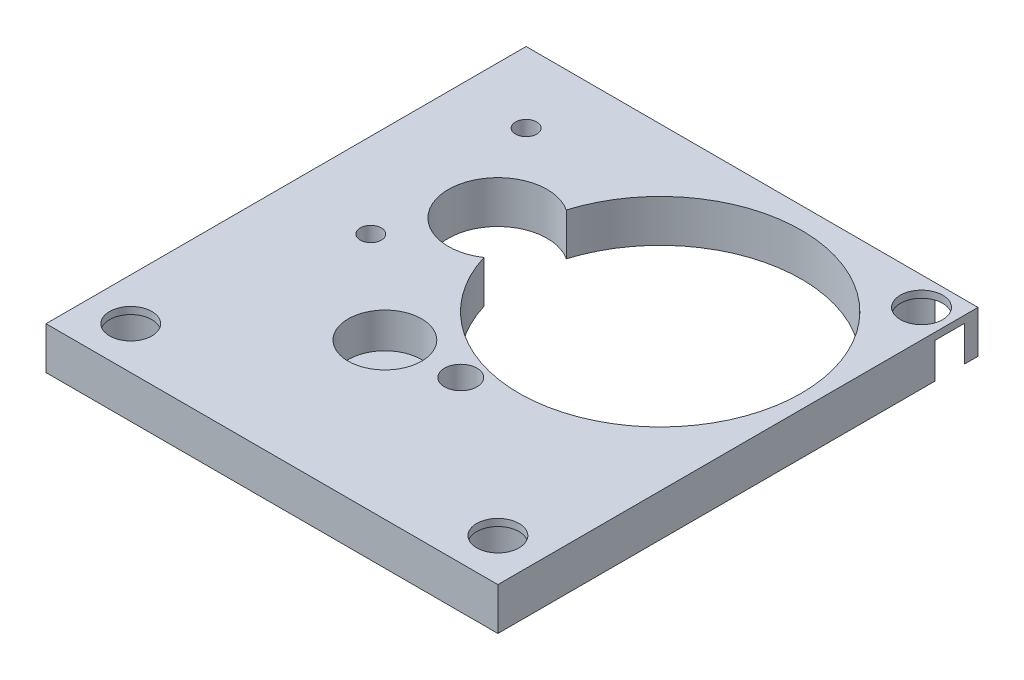
ISO-10303-21;
HEADER;
FILE_DESCRIPTION(('STEP AP214'),'2;1');
FILE_NAME('part.step','',(''),(''),'','','');
FILE_SCHEMA(('AUTOMOTIVE_DESIGN { 1 0 10303 214 1 1 1 1 }'));
ENDSEC;
DATA;
#1=APPLICATION_CONTEXT('core data for automotive mechanical design processes');
#2=APPLICATION_PROTOCOL_DEFINITION('international standard','automotive_design',2000,#1);
#3=PRODUCT_CONTEXT('',#1,'mechanical');
#4=PRODUCT('Part','Part','',(#3));
#5=PRODUCT_RELATED_PRODUCT_CATEGORY('part','',(#4));
#6=PRODUCT_DEFINITION_FORMATION('','',#4);
#7=PRODUCT_DEFINITION_CONTEXT('part definition',#1,'design');
#8=PRODUCT_DEFINITION('design','',#6,#7);
#9=PRODUCT_DEFINITION_SHAPE('','',#8);
#10=(LENGTH_UNIT() NAMED_UNIT(*) SI_UNIT(.MILLI.,.METRE.));
#11=(NAMED_UNIT(*) PLANE_ANGLE_UNIT() SI_UNIT($,.RADIAN.));
#12=(NAMED_UNIT(*) SI_UNIT($,.STERADIAN.) SOLID_ANGLE_UNIT());
#13=UNCERTAINTY_MEASURE_WITH_UNIT(LENGTH_MEASURE(1.E-05),#10,'distance_accuracy_value','');
#14=(GEOMETRIC_REPRESENTATION_CONTEXT(3) GLOBAL_UNCERTAINTY_ASSIGNED_CONTEXT((#13)) GLOBAL_UNIT_ASSIGNED_CONTEXT((#10,
#11,#12)) REPRESENTATION_CONTEXT('',''));
#15=CARTESIAN_POINT('',(0.,0.,0.));
#16=DIRECTION('',(0.,0.,1.));
#17=DIRECTION('',(1.,0.,0.));
#18=AXIS2_PLACEMENT_3D('',#15,#16,#17);
#19=CARTESIAN_POINT('',(0.,-0.5,0.));
#20=DIRECTION('',(0.,-1.,0.));
#21=DIRECTION('',(0.,0.,-1.));
#22=AXIS2_PLACEMENT_3D('',#19,#20,#21);
#23=PLANE('',#22);
#24=CARTESIAN_POINT('',(16.9999999999998,-0.5,-20.9999999999998));
#25=DIRECTION('',(0.,-1.,0.));
#26=DIRECTION('',(0.,0.,-1.));
#27=AXIS2_PLACEMENT_3D('',#24,#25,#26);
#28=CIRCLE('',#27,2.25);
#29=CARTESIAN_POINT('',(18.0307764064039,-0.5,-23.));
#30=VERTEX_POINT('',#29);
#31=CARTESIAN_POINT('',(19.,-0.5,-22.0307764064039));
#32=VERTEX_POINT('',#31);
#33=EDGE_CURVE('E210',#30,#32,#28,.T.);
#34=ORIENTED_EDGE('',*,*,#33,.F.);
#35=DIRECTION('',(1.,0.,0.));
#36=VECTOR('',#35,1.);
#37=CARTESIAN_POINT('',(-13.,-0.5,-23.));
#38=LINE('',#37,#36);
#39=CARTESIAN_POINT('',(19.,-0.5,-23.));
#40=VERTEX_POINT('',#39);
#41=EDGE_CURVE('E222',#30,#40,#38,.T.);
#42=ORIENTED_EDGE('',*,*,#41,.T.);
#43=DIRECTION('',(0.,0.,1.));
#44=VECTOR('',#43,1.);
#45=CARTESIAN_POINT('',(19.,-0.5,-23.));
#46=LINE('',#45,#44);
#47=EDGE_CURVE('E225',#40,#32,#46,.T.);
#48=ORIENTED_EDGE('',*,*,#47,.T.);
#49=EDGE_LOOP('',(#34,#42,#48));
#50=FACE_BOUND('',#49,.T.);
#51=ADVANCED_FACE('F128',(#50),#23,.T.);
#52=CARTESIAN_POINT('',(-9.99999999999997,2.5,8.00000000000007));
#53=DIRECTION('',(0.,-1.,0.));
#54=DIRECTION('',(0.,0.,-1.));
#55=AXIS2_PLACEMENT_3D('',#52,#53,#54);
#56=CYLINDRICAL_SURFACE('',#55,1.5);
#57=CARTESIAN_POINT('',(-9.99999999999997,2.5,8.00000000000007));
#58=DIRECTION('',(0.,-1.,0.));
#59=DIRECTION('',(0.,0.,-1.));
#60=AXIS2_PLACEMENT_3D('',#57,#58,#59);
#61=CIRCLE('',#60,1.5);
#62=CARTESIAN_POINT('',(-9.99999999999997,2.5,6.50000000000007));
#63=VERTEX_POINT('',#62);
#64=EDGE_CURVE('E217',#63,#63,#61,.T.);
#65=ORIENTED_EDGE('',*,*,#64,.F.);
#66=EDGE_LOOP('',(#65));
#67=FACE_BOUND('',#66,.T.);
#68=CARTESIAN_POINT('',(-9.99999999999997,2.,8.00000000000007));
#69=DIRECTION('',(0.,-1.,0.));
#70=DIRECTION('',(0.,0.,-1.));
#71=AXIS2_PLACEMENT_3D('',#68,#69,#70);
#72=CIRCLE('',#71,1.5);
#73=CARTESIAN_POINT('',(-9.99999999999997,2.,6.50000000000007));
#74=VERTEX_POINT('',#73);
#75=EDGE_CURVE('E132',#74,#74,#72,.F.);
#76=ORIENTED_EDGE('',*,*,#75,.F.);
#77=EDGE_LOOP('',(#76));
#78=FACE_BOUND('',#77,.T.);
#79=ADVANCED_FACE('F331',(#67,#78),#56,.F.);
#80=CARTESIAN_POINT('',(16.,2.5,8.00000000000007));
#81=DIRECTION('',(0.,-1.,0.));
#82=DIRECTION('',(0.,0.,-1.));
#83=AXIS2_PLACEMENT_3D('',#80,#81,#82);
#84=CYLINDRICAL_SURFACE('',#83,1.5);
#85=CARTESIAN_POINT('',(16.,2.5,8.00000000000007));
#86=DIRECTION('',(0.,-1.,0.));
#87=DIRECTION('',(0.,0.,-1.));
#88=AXIS2_PLACEMENT_3D('',#85,#86,#87);
#89=CIRCLE('',#88,1.5);
#90=CARTESIAN_POINT('',(16.,2.5,6.50000000000007));
#91=VERTEX_POINT('',#90);
#92=EDGE_CURVE('E299',#91,#91,#89,.T.);
#93=ORIENTED_EDGE('',*,*,#92,.F.);
#94=EDGE_LOOP('',(#93));
#95=FACE_BOUND('',#94,.T.);
#96=CARTESIAN_POINT('',(16.,2.,8.00000000000007));
#97=DIRECTION('',(0.,-1.,0.));
#98=DIRECTION('',(0.,0.,-1.));
#99=AXIS2_PLACEMENT_3D('',#96,#97,#98);
#100=CIRCLE('',#99,1.5);
#101=CARTESIAN_POINT('',(16.,2.,6.50000000000007));
#102=VERTEX_POINT('',#101);
#103=EDGE_CURVE('E280',#102,#102,#100,.F.);
#104=ORIENTED_EDGE('',*,*,#103,.F.);
#105=EDGE_LOOP('',(#104));
#106=FACE_BOUND('',#105,.T.);
#107=ADVANCED_FACE('F323',(#95,#106),#84,.F.);
#108=CARTESIAN_POINT('',(16.9999999999998,2.5,-20.9999999999998));
#109=DIRECTION('',(0.,-1.,0.));
#110=DIRECTION('',(0.,0.,-1.));
#111=AXIS2_PLACEMENT_3D('',#108,#109,#110);
#112=CYLINDRICAL_SURFACE('',#111,1.5);
#113=CARTESIAN_POINT('',(16.9999999999998,2.5,-20.9999999999998));
#114=DIRECTION('',(0.,-1.,0.));
#115=DIRECTION('',(0.,0.,-1.));
#116=AXIS2_PLACEMENT_3D('',#113,#114,#115);
#117=CIRCLE('',#116,1.5);
#118=CARTESIAN_POINT('',(16.9999999999998,2.5,-22.4999999999998));
#119=VERTEX_POINT('',#118);
#120=EDGE_CURVE('E296',#119,#119,#117,.T.);
#121=ORIENTED_EDGE('',*,*,#120,.F.);
#122=EDGE_LOOP('',(#121));
#123=FACE_BOUND('',#122,.T.);
#124=CARTESIAN_POINT('',(16.9999999999998,2.,-20.9999999999998));
#125=DIRECTION('',(0.,-1.,0.));
#126=DIRECTION('',(0.,0.,-1.));
#127=AXIS2_PLACEMENT_3D('',#124,#125,#126);
#128=CIRCLE('',#127,1.5);
#129=CARTESIAN_POINT('',(16.9999999999998,2.,-22.4999999999998));
#130=VERTEX_POINT('',#129);
#131=EDGE_CURVE('E276',#130,#130,#128,.F.);
#132=ORIENTED_EDGE('',*,*,#131,.F.);
#133=EDGE_LOOP('',(#132));
#134=FACE_BOUND('',#133,.T.);
#135=ADVANCED_FACE('F315',(#123,#134),#112,.F.);
#136=CARTESIAN_POINT('',(0.,2.5,0.));
#137=DIRECTION('',(0.,-1.,0.));
#138=DIRECTION('',(0.,0.,-1.));
#139=AXIS2_PLACEMENT_3D('',#136,#137,#138);
#140=PLANE('',#139);
#141=CARTESIAN_POINT('',(4.98501881873766,2.5,-0.386765273559278));
#142=DIRECTION('',(0.,1.,0.));
#143=DIRECTION('',(0.,0.,1.));
#144=AXIS2_PLACEMENT_3D('',#141,#142,#143);
#145=CIRCLE('',#144,1.15);
#146=CARTESIAN_POINT('',(4.98501881873766,2.5,0.763234726440721));
#147=VERTEX_POINT('',#146);
#148=EDGE_CURVE('E389',#147,#147,#145,.T.);
#149=ORIENTED_EDGE('',*,*,#148,.F.);
#150=EDGE_LOOP('',(#149));
#151=FACE_BOUND('',#150,.T.);
#152=CARTESIAN_POINT('',(-7.,2.5,-5.99999999999993));
#153=DIRECTION('',(0.,-1.,0.));
#154=DIRECTION('',(0.,0.,-1.));
#155=AXIS2_PLACEMENT_3D('',#152,#153,#154);
#156=CIRCLE('',#155,0.749999999999687);
#157=CARTESIAN_POINT('',(-7.,2.5,-6.74999999999962));
#158=VERTEX_POINT('',#157);
#159=EDGE_CURVE('E385',#158,#158,#156,.T.);
#160=ORIENTED_EDGE('',*,*,#159,.T.);
#161=EDGE_LOOP('',(#160));
#162=FACE_BOUND('',#161,.T.);
#163=CARTESIAN_POINT('',(-8.,2.5,-18.));
#164=DIRECTION('',(0.,-1.,0.));
#165=DIRECTION('',(0.,0.,-1.));
#166=AXIS2_PLACEMENT_3D('',#163,#164,#165);
#167=CIRCLE('',#166,0.75);
#168=CARTESIAN_POINT('',(-8.,2.5,-18.75));
#169=VERTEX_POINT('',#168);
#170=EDGE_CURVE('E381',#169,#169,#167,.T.);
#171=ORIENTED_EDGE('',*,*,#170,.T.);
#172=EDGE_LOOP('',(#171));
#173=FACE_BOUND('',#172,.T.);
#174=ORIENTED_EDGE('',*,*,#120,.T.);
#175=EDGE_LOOP('',(#174));
#176=FACE_BOUND('',#175,.T.);
#177=ORIENTED_EDGE('',*,*,#92,.T.);
#178=EDGE_LOOP('',(#177));
#179=FACE_BOUND('',#178,.T.);
#180=ORIENTED_EDGE('',*,*,#64,.T.);
#181=EDGE_LOOP('',(#180));
#182=FACE_BOUND('',#181,.T.);
#183=CARTESIAN_POINT('',(0.,2.5,0.));
#184=DIRECTION('',(0.,1.,0.));
#185=DIRECTION('',(0.,0.,1.));
#186=AXIS2_PLACEMENT_3D('',#183,#184,#185);
#187=CIRCLE('',#186,2.6);
#188=CARTESIAN_POINT('',(0.,2.5,2.6));
#189=VERTEX_POINT('',#188);
#190=EDGE_CURVE('E253',#189,#189,#187,.T.);
#191=ORIENTED_EDGE('',*,*,#190,.F.);
#192=EDGE_LOOP('',(#191));
#193=FACE_BOUND('',#192,.T.);
#194=DIRECTION('',(1.,0.,0.));
#195=VECTOR('',#194,1.);
#196=CARTESIAN_POINT('',(-13.,2.5,-23.));
#197=LINE('',#196,#195);
#198=CARTESIAN_POINT('',(-13.,2.5,-23.));
#199=VERTEX_POINT('',#198);
#200=CARTESIAN_POINT('',(19.,2.5,-23.));
#201=VERTEX_POINT('',#200);
#202=EDGE_CURVE('E256',#199,#201,#197,.T.);
#203=ORIENTED_EDGE('',*,*,#202,.F.);
#204=DIRECTION('',(0.,0.,1.));
#205=VECTOR('',#204,1.);
#206=CARTESIAN_POINT('',(-13.,2.5,-23.));
#207=LINE('',#206,#205);
#208=CARTESIAN_POINT('',(-13.,2.5,11.0000000000001));
#209=VERTEX_POINT('',#208);
#210=EDGE_CURVE('E265',#199,#209,#207,.T.);
#211=ORIENTED_EDGE('',*,*,#210,.T.);
#212=DIRECTION('',(1.,0.,0.));
#213=VECTOR('',#212,1.);
#214=CARTESIAN_POINT('',(-13.,2.5,11.0000000000001));
#215=LINE('',#214,#213);
#216=CARTESIAN_POINT('',(19.,2.5,11.0000000000001));
#217=VERTEX_POINT('',#216);
#218=EDGE_CURVE('E263',#209,#217,#215,.T.);
#219=ORIENTED_EDGE('',*,*,#218,.T.);
#220=DIRECTION('',(0.,0.,1.));
#221=VECTOR('',#220,1.);
#222=CARTESIAN_POINT('',(19.,2.5,-23.));
#223=LINE('',#222,#221);
#224=EDGE_CURVE('E260',#201,#217,#223,.T.);
#225=ORIENTED_EDGE('',*,*,#224,.F.);
#226=EDGE_LOOP('',(#203,#211,#219,#225));
#227=FACE_BOUND('',#226,.T.);
#228=CARTESIAN_POINT('',(8.01086956521739,2.5,-11.4815490596467));
#229=DIRECTION('',(0.,1.,0.));
#230=DIRECTION('',(0.,0.,1.));
#231=AXIS2_PLACEMENT_3D('',#228,#229,#230);
#232=CIRCLE('',#231,10.);
#233=CARTESIAN_POINT('',(-1.55434782608696,2.5,-8.56493865421218));
#234=VERTEX_POINT('',#233);
#235=CARTESIAN_POINT('',(-1.55434782608696,2.5,-14.3981594650812));
#236=VERTEX_POINT('',#235);
#237=EDGE_CURVE('E153',#234,#236,#232,.T.);
#238=ORIENTED_EDGE('',*,*,#237,.F.);
#239=CARTESIAN_POINT('',(-3.48913043478261,2.5,-11.4815490596467));
#240=DIRECTION('',(0.,1.,0.));
#241=DIRECTION('',(0.,0.,1.));
#242=AXIS2_PLACEMENT_3D('',#239,#240,#241);
#243=CIRCLE('',#242,3.5);
#244=EDGE_CURVE('E249',#236,#234,#243,.T.);
#245=ORIENTED_EDGE('',*,*,#244,.F.);
#246=EDGE_LOOP('',(#238,#245));
#247=FACE_BOUND('',#246,.T.);
#248=ADVANCED_FACE('F313',(#151,#162,#173,#176,#179,#182,#193,#227,#247),#140,.F.);
#249=CARTESIAN_POINT('',(-3.48913043478261,2.5,-11.4815490596467));
#250=DIRECTION('',(0.,-1.,0.));
#251=DIRECTION('',(0.,0.,-1.));
#252=AXIS2_PLACEMENT_3D('',#249,#250,#251);
#253=CYLINDRICAL_SURFACE('',#252,3.5);
#254=ORIENTED_EDGE('',*,*,#244,.T.);
#255=DIRECTION('',(0.,-1.,0.));
#256=VECTOR('',#255,1.);
#257=CARTESIAN_POINT('',(-1.55434782608696,1.25,-8.56493865421218));
#258=LINE('',#257,#256);
#259=CARTESIAN_POINT('',(-1.55434782608696,-0.5,-8.56493865421218));
#260=VERTEX_POINT('',#259);
#261=EDGE_CURVE('E12',#234,#260,#258,.T.);
#262=ORIENTED_EDGE('',*,*,#261,.T.);
#263=CARTESIAN_POINT('',(-3.48913043478261,-0.5,-11.4815490596467));
#264=DIRECTION('',(0.,1.,0.));
#265=DIRECTION('',(0.,0.,1.));
#266=AXIS2_PLACEMENT_3D('',#263,#264,#265);
#267=CIRCLE('',#266,3.5);
#268=CARTESIAN_POINT('',(-1.55434782608696,-0.5,-14.3981594650812));
#269=VERTEX_POINT('',#268);
#270=EDGE_CURVE('E232',#269,#260,#267,.T.);
#271=ORIENTED_EDGE('',*,*,#270,.F.);
#272=DIRECTION('',(0.,-1.,0.));
#273=VECTOR('',#272,1.);
#274=CARTESIAN_POINT('',(-1.55434782608696,1.25,-14.3981594650812));
#275=LINE('',#274,#273);
#276=EDGE_CURVE('E137',#269,#236,#275,.F.);
#277=ORIENTED_EDGE('',*,*,#276,.T.);
#278=EDGE_LOOP('',(#254,#262,#271,#277));
#279=FACE_BOUND('',#278,.T.);
#280=ADVANCED_FACE('F309',(#279),#253,.F.);
#281=CARTESIAN_POINT('',(-13.,2.5,-23.));
#282=DIRECTION('',(0.,0.,-1.));
#283=DIRECTION('',(-1.,0.,0.));
#284=AXIS2_PLACEMENT_3D('',#281,#282,#283);
#285=PLANE('',#284);
#286=DIRECTION('',(0.,-1.,0.));
#287=VECTOR('',#286,1.);
#288=CARTESIAN_POINT('',(18.0307764064039,2.,-23.));
#289=LINE('',#288,#287);
#290=CARTESIAN_POINT('',(18.0307764064039,2.,-23.));
#291=VERTEX_POINT('',#290);
#292=EDGE_CURVE('E207',#291,#30,#289,.T.);
#293=ORIENTED_EDGE('',*,*,#292,.F.);
#294=DIRECTION('',(-1.,0.,0.));
#295=VECTOR('',#294,1.);
#296=CARTESIAN_POINT('',(-13.,2.,-23.));
#297=LINE('',#296,#295);
#298=CARTESIAN_POINT('',(15.9692235935957,2.,-23.));
#299=VERTEX_POINT('',#298);
#300=EDGE_CURVE('E282',#291,#299,#297,.T.);
#301=ORIENTED_EDGE('',*,*,#300,.T.);
#302=DIRECTION('',(0.,-1.,0.));
#303=VECTOR('',#302,1.);
#304=CARTESIAN_POINT('',(15.9692235935957,2.,-23.));
#305=LINE('',#304,#303);
#306=CARTESIAN_POINT('',(15.9692235935957,-0.5,-23.));
#307=VERTEX_POINT('',#306);
#308=EDGE_CURVE('E218',#307,#299,#305,.F.);
#309=ORIENTED_EDGE('',*,*,#308,.F.);
#310=CARTESIAN_POINT('',(-13.,-0.5,-23.));
#311=VERTEX_POINT('',#310);
#312=EDGE_CURVE('E231',#311,#307,#38,.T.);
#313=ORIENTED_EDGE('',*,*,#312,.F.);
#314=DIRECTION('',(0.,-1.,0.));
#315=VECTOR('',#314,1.);
#316=CARTESIAN_POINT('',(-13.,2.5,-23.));
#317=LINE('',#316,#315);
#318=EDGE_CURVE('E267',#199,#311,#317,.T.);
#319=ORIENTED_EDGE('',*,*,#318,.F.);
#320=ORIENTED_EDGE('',*,*,#202,.T.);
#321=DIRECTION('',(0.,-1.,0.));
#322=VECTOR('',#321,1.);
#323=CARTESIAN_POINT('',(19.,2.5,-23.));
#324=LINE('',#323,#322);
#325=EDGE_CURVE('E230',#201,#40,#324,.T.);
#326=ORIENTED_EDGE('',*,*,#325,.T.);
#327=ORIENTED_EDGE('',*,*,#41,.F.);
#328=EDGE_LOOP('',(#293,#301,#309,#313,#319,#320,#326,#327));
#329=FACE_BOUND('',#328,.T.);
#330=ADVANCED_FACE('F130',(#329),#285,.T.);
#331=CARTESIAN_POINT('',(-13.,2.5,-23.));
#332=DIRECTION('',(1.,0.,0.));
#333=DIRECTION('',(0.,0.,-1.));
#334=AXIS2_PLACEMENT_3D('',#331,#332,#333);
#335=PLANE('',#334);
#336=ORIENTED_EDGE('',*,*,#318,.T.);
#337=DIRECTION('',(0.,0.,1.));
#338=VECTOR('',#337,1.);
#339=CARTESIAN_POINT('',(-13.,-0.5,-23.));
#340=LINE('',#339,#338);
#341=CARTESIAN_POINT('',(-13.,-0.5,11.0000000000001));
#342=VERTEX_POINT('',#341);
#343=EDGE_CURVE('E245',#311,#342,#340,.T.);
#344=ORIENTED_EDGE('',*,*,#343,.T.);
#345=DIRECTION('',(0.,-1.,0.));
#346=VECTOR('',#345,1.);
#347=CARTESIAN_POINT('',(-13.,2.5,11.0000000000001));
#348=LINE('',#347,#346);
#349=EDGE_CURVE('E269',#209,#342,#348,.T.);
#350=ORIENTED_EDGE('',*,*,#349,.F.);
#351=ORIENTED_EDGE('',*,*,#210,.F.);
#352=EDGE_LOOP('',(#336,#344,#350,#351));
#353=FACE_BOUND('',#352,.T.);
#354=ADVANCED_FACE('F446',(#353),#335,.F.);
#355=CARTESIAN_POINT('',(-13.,2.5,11.0000000000001));
#356=DIRECTION('',(0.,0.,-1.));
#357=DIRECTION('',(-1.,0.,0.));
#358=AXIS2_PLACEMENT_3D('',#355,#356,#357);
#359=PLANE('',#358);
#360=ORIENTED_EDGE('',*,*,#349,.T.);
#361=DIRECTION('',(1.,0.,0.));
#362=VECTOR('',#361,1.);
#363=CARTESIAN_POINT('',(-13.,-0.5,11.0000000000001));
#364=LINE('',#363,#362);
#365=CARTESIAN_POINT('',(19.,-0.5,11.0000000000001));
#366=VERTEX_POINT('',#365);
#367=EDGE_CURVE('E242',#342,#366,#364,.T.);
#368=ORIENTED_EDGE('',*,*,#367,.T.);
#369=DIRECTION('',(0.,-1.,0.));
#370=VECTOR('',#369,1.);
#371=CARTESIAN_POINT('',(19.,2.5,11.0000000000001));
#372=LINE('',#371,#370);
#373=EDGE_CURVE('E271',#217,#366,#372,.T.);
#374=ORIENTED_EDGE('',*,*,#373,.F.);
#375=ORIENTED_EDGE('',*,*,#218,.F.);
#376=EDGE_LOOP('',(#360,#368,#374,#375));
#377=FACE_BOUND('',#376,.T.);
#378=ADVANCED_FACE('F451',(#377),#359,.F.);
#379=CARTESIAN_POINT('',(19.,2.5,-23.));
#380=DIRECTION('',(1.,0.,0.));
#381=DIRECTION('',(0.,0.,-1.));
#382=AXIS2_PLACEMENT_3D('',#379,#380,#381);
#383=PLANE('',#382);
#384=DIRECTION('',(0.,-1.,0.));
#385=VECTOR('',#384,1.);
#386=CARTESIAN_POINT('',(19.,2.,-19.9692235935957));
#387=LINE('',#386,#385);
#388=CARTESIAN_POINT('',(19.,2.,-19.9692235935957));
#389=VERTEX_POINT('',#388);
#390=CARTESIAN_POINT('',(19.,-0.5,-19.9692235935957));
#391=VERTEX_POINT('',#390);
#392=EDGE_CURVE('E145',#389,#391,#387,.T.);
#393=ORIENTED_EDGE('',*,*,#392,.F.);
#394=DIRECTION('',(0.,0.,-1.));
#395=VECTOR('',#394,1.);
#396=CARTESIAN_POINT('',(19.,2.,-23.));
#397=LINE('',#396,#395);
#398=CARTESIAN_POINT('',(19.,2.,-22.0307764064039));
#399=VERTEX_POINT('',#398);
#400=EDGE_CURVE('E278',#389,#399,#397,.T.);
#401=ORIENTED_EDGE('',*,*,#400,.T.);
#402=DIRECTION('',(0.,-1.,0.));
#403=VECTOR('',#402,1.);
#404=CARTESIAN_POINT('',(19.,2.,-22.0307764064039));
#405=LINE('',#404,#403);
#406=EDGE_CURVE('E286',#32,#399,#405,.F.);
#407=ORIENTED_EDGE('',*,*,#406,.F.);
#408=ORIENTED_EDGE('',*,*,#47,.F.);
#409=ORIENTED_EDGE('',*,*,#325,.F.);
#410=ORIENTED_EDGE('',*,*,#224,.T.);
#411=ORIENTED_EDGE('',*,*,#373,.T.);
#412=EDGE_CURVE('E235',#391,#366,#46,.T.);
#413=ORIENTED_EDGE('',*,*,#412,.F.);
#414=EDGE_LOOP('',(#393,#401,#407,#408,#409,#410,#411,#413));
#415=FACE_BOUND('',#414,.T.);
#416=ADVANCED_FACE('F453',(#415),#383,.T.);
#417=CARTESIAN_POINT('',(0.,2.5,0.));
#418=DIRECTION('',(0.,-1.,0.));
#419=DIRECTION('',(0.,0.,-1.));
#420=AXIS2_PLACEMENT_3D('',#417,#418,#419);
#421=CYLINDRICAL_SURFACE('',#420,2.6);
#422=ORIENTED_EDGE('',*,*,#190,.T.);
#423=EDGE_LOOP('',(#422));
#424=FACE_BOUND('',#423,.T.);
#425=CARTESIAN_POINT('',(0.,0.,0.));
#426=DIRECTION('',(0.,1.,0.));
#427=DIRECTION('',(0.,0.,1.));
#428=AXIS2_PLACEMENT_3D('',#425,#426,#427);
#429=CIRCLE('',#428,2.6);
#430=CARTESIAN_POINT('',(0.,0.,2.6));
#431=VERTEX_POINT('',#430);
#432=EDGE_CURVE('E252',#431,#431,#429,.T.);
#433=ORIENTED_EDGE('',*,*,#432,.F.);
#434=EDGE_LOOP('',(#433));
#435=FACE_BOUND('',#434,.T.);
#436=ADVANCED_FACE('F459',(#424,#435),#421,.F.);
#437=CARTESIAN_POINT('',(8.01086956521739,2.5,-11.4815490596467));
#438=DIRECTION('',(0.,-1.,0.));
#439=DIRECTION('',(0.,0.,-1.));
#440=AXIS2_PLACEMENT_3D('',#437,#438,#439);
#441=CYLINDRICAL_SURFACE('',#440,10.);
#442=ORIENTED_EDGE('',*,*,#237,.T.);
#443=ORIENTED_EDGE('',*,*,#276,.F.);
#444=CARTESIAN_POINT('',(8.01086956521739,-0.5,-11.4815490596467));
#445=DIRECTION('',(0.,1.,0.));
#446=DIRECTION('',(0.,0.,1.));
#447=AXIS2_PLACEMENT_3D('',#444,#445,#446);
#448=CIRCLE('',#447,10.);
#449=EDGE_CURVE('E237',#260,#269,#448,.T.);
#450=ORIENTED_EDGE('',*,*,#449,.F.);
#451=ORIENTED_EDGE('',*,*,#261,.F.);
#452=EDGE_LOOP('',(#442,#443,#450,#451));
#453=FACE_BOUND('',#452,.T.);
#454=ADVANCED_FACE('F311',(#453),#441,.F.);
#455=CARTESIAN_POINT('',(0.,0.,0.));
#456=DIRECTION('',(0.,-1.,0.));
#457=DIRECTION('',(0.,0.,-1.));
#458=AXIS2_PLACEMENT_3D('',#455,#456,#457);
#459=PLANE('',#458);
#460=ORIENTED_EDGE('',*,*,#432,.T.);
#461=EDGE_LOOP('',(#460));
#462=FACE_BOUND('',#461,.T.);
#463=ADVANCED_FACE('F340',(#462),#459,.F.);
#464=CARTESIAN_POINT('',(4.98501881873766,-0.5,-0.386765273559278));
#465=DIRECTION('',(0.,1.,0.));
#466=DIRECTION('',(0.,0.,1.));
#467=AXIS2_PLACEMENT_3D('',#464,#465,#466);
#468=CIRCLE('',#467,1.15);
#469=CARTESIAN_POINT('',(4.98501881873766,-0.5,0.763234726440721));
#470=VERTEX_POINT('',#469);
#471=EDGE_CURVE('E353',#470,#470,#468,.T.);
#472=ORIENTED_EDGE('',*,*,#471,.T.);
#473=EDGE_LOOP('',(#472));
#474=FACE_BOUND('',#473,.T.);
#475=CARTESIAN_POINT('',(-7.,-0.5,-5.99999999999993));
#476=DIRECTION('',(0.,-1.,0.));
#477=DIRECTION('',(0.,0.,-1.));
#478=AXIS2_PLACEMENT_3D('',#475,#476,#477);
#479=CIRCLE('',#478,0.749999999999687);
#480=CARTESIAN_POINT('',(-7.,-0.5,-6.74999999999962));
#481=VERTEX_POINT('',#480);
#482=EDGE_CURVE('E357',#481,#481,#479,.T.);
#483=ORIENTED_EDGE('',*,*,#482,.F.);
#484=EDGE_LOOP('',(#483));
#485=FACE_BOUND('',#484,.T.);
#486=CARTESIAN_POINT('',(-8.,-0.5,-18.));
#487=DIRECTION('',(0.,-1.,0.));
#488=DIRECTION('',(0.,0.,-1.));
#489=AXIS2_PLACEMENT_3D('',#486,#487,#488);
#490=CIRCLE('',#489,0.75);
#491=CARTESIAN_POINT('',(-8.,-0.5,-18.75));
#492=VERTEX_POINT('',#491);
#493=EDGE_CURVE('E361',#492,#492,#490,.T.);
#494=ORIENTED_EDGE('',*,*,#493,.F.);
#495=EDGE_LOOP('',(#494));
#496=FACE_BOUND('',#495,.T.);
#497=EDGE_CURVE('E227',#391,#307,#28,.T.);
#498=ORIENTED_EDGE('',*,*,#497,.F.);
#499=ORIENTED_EDGE('',*,*,#412,.T.);
#500=ORIENTED_EDGE('',*,*,#367,.F.);
#501=ORIENTED_EDGE('',*,*,#343,.F.);
#502=ORIENTED_EDGE('',*,*,#312,.T.);
#503=EDGE_LOOP('',(#498,#499,#500,#501,#502));
#504=FACE_BOUND('',#503,.T.);
#505=CARTESIAN_POINT('',(-9.99999999999997,-0.5,8.00000000000007));
#506=DIRECTION('',(0.,-1.,0.));
#507=DIRECTION('',(0.,0.,-1.));
#508=AXIS2_PLACEMENT_3D('',#505,#506,#507);
#509=CIRCLE('',#508,2.25);
#510=CARTESIAN_POINT('',(-9.99999999999997,-0.5,5.75000000000007));
#511=VERTEX_POINT('',#510);
#512=EDGE_CURVE('E367',#511,#511,#509,.T.);
#513=ORIENTED_EDGE('',*,*,#512,.F.);
#514=EDGE_LOOP('',(#513));
#515=FACE_BOUND('',#514,.T.);
#516=CARTESIAN_POINT('',(16.,-0.5,8.00000000000007));
#517=DIRECTION('',(0.,-1.,0.));
#518=DIRECTION('',(0.,0.,-1.));
#519=AXIS2_PLACEMENT_3D('',#516,#517,#518);
#520=CIRCLE('',#519,2.25);
#521=CARTESIAN_POINT('',(16.,-0.5,5.75000000000007));
#522=VERTEX_POINT('',#521);
#523=EDGE_CURVE('E370',#522,#522,#520,.T.);
#524=ORIENTED_EDGE('',*,*,#523,.F.);
#525=EDGE_LOOP('',(#524));
#526=FACE_BOUND('',#525,.T.);
#527=ORIENTED_EDGE('',*,*,#449,.T.);
#528=ORIENTED_EDGE('',*,*,#270,.T.);
#529=EDGE_LOOP('',(#527,#528));
#530=FACE_BOUND('',#529,.T.);
#531=ADVANCED_FACE('F307',(#474,#485,#496,#504,#515,#526,#530),#23,.T.);
#532=CARTESIAN_POINT('',(16.9999999999998,2.,-20.9999999999998));
#533=DIRECTION('',(0.,-1.,0.));
#534=DIRECTION('',(0.,0.,-1.));
#535=AXIS2_PLACEMENT_3D('',#532,#533,#534);
#536=CYLINDRICAL_SURFACE('',#535,2.25);
#537=ORIENTED_EDGE('',*,*,#292,.T.);
#538=ORIENTED_EDGE('',*,*,#33,.T.);
#539=ORIENTED_EDGE('',*,*,#406,.T.);
#540=CARTESIAN_POINT('',(16.9999999999998,2.,-20.9999999999998));
#541=DIRECTION('',(0.,-1.,0.));
#542=DIRECTION('',(0.,0.,-1.));
#543=AXIS2_PLACEMENT_3D('',#540,#541,#542);
#544=CIRCLE('',#543,2.25);
#545=EDGE_CURVE('E213',#291,#399,#544,.T.);
#546=ORIENTED_EDGE('',*,*,#545,.F.);
#547=EDGE_LOOP('',(#537,#538,#539,#546));
#548=FACE_BOUND('',#547,.T.);
#549=ADVANCED_FACE('F209',(#548),#536,.F.);
#550=CARTESIAN_POINT('',(16.9999999999998,2.,-20.9999999999998));
#551=DIRECTION('',(0.,-1.,0.));
#552=DIRECTION('',(0.,0.,-1.));
#553=AXIS2_PLACEMENT_3D('',#550,#551,#552);
#554=PLANE('',#553);
#555=ORIENTED_EDGE('',*,*,#545,.T.);
#556=ORIENTED_EDGE('',*,*,#400,.F.);
#557=EDGE_CURVE('E376',#389,#299,#544,.T.);
#558=ORIENTED_EDGE('',*,*,#557,.T.);
#559=ORIENTED_EDGE('',*,*,#300,.F.);
#560=EDGE_LOOP('',(#555,#556,#558,#559));
#561=FACE_BOUND('',#560,.T.);
#562=ORIENTED_EDGE('',*,*,#131,.T.);
#563=EDGE_LOOP('',(#562));
#564=FACE_BOUND('',#563,.T.);
#565=ADVANCED_FACE('F346',(#561,#564),#554,.T.);
#566=ORIENTED_EDGE('',*,*,#308,.T.);
#567=ORIENTED_EDGE('',*,*,#557,.F.);
#568=ORIENTED_EDGE('',*,*,#392,.T.);
#569=ORIENTED_EDGE('',*,*,#497,.T.);
#570=EDGE_LOOP('',(#566,#567,#568,#569));
#571=FACE_BOUND('',#570,.T.);
#572=ADVANCED_FACE('F348',(#571),#536,.F.);
#573=CARTESIAN_POINT('',(16.,2.,8.00000000000007));
#574=DIRECTION('',(0.,-1.,0.));
#575=DIRECTION('',(0.,0.,-1.));
#576=AXIS2_PLACEMENT_3D('',#573,#574,#575);
#577=PLANE('',#576);
#578=CARTESIAN_POINT('',(16.,2.,8.00000000000007));
#579=DIRECTION('',(0.,-1.,0.));
#580=DIRECTION('',(0.,0.,-1.));
#581=AXIS2_PLACEMENT_3D('',#578,#579,#580);
#582=CIRCLE('',#581,2.25);
#583=CARTESIAN_POINT('',(16.,2.,5.75000000000007));
#584=VERTEX_POINT('',#583);
#585=EDGE_CURVE('E279',#584,#584,#582,.T.);
#586=ORIENTED_EDGE('',*,*,#585,.T.);
#587=EDGE_LOOP('',(#586));
#588=FACE_BOUND('',#587,.T.);
#589=ORIENTED_EDGE('',*,*,#103,.T.);
#590=EDGE_LOOP('',(#589));
#591=FACE_BOUND('',#590,.T.);
#592=ADVANCED_FACE('F417',(#588,#591),#577,.T.);
#593=CARTESIAN_POINT('',(16.,2.,8.00000000000007));
#594=DIRECTION('',(0.,-1.,0.));
#595=DIRECTION('',(0.,0.,-1.));
#596=AXIS2_PLACEMENT_3D('',#593,#594,#595);
#597=CYLINDRICAL_SURFACE('',#596,2.25);
#598=ORIENTED_EDGE('',*,*,#585,.F.);
#599=EDGE_LOOP('',(#598));
#600=FACE_BOUND('',#599,.T.);
#601=ORIENTED_EDGE('',*,*,#523,.T.);
#602=EDGE_LOOP('',(#601));
#603=FACE_BOUND('',#602,.T.);
#604=ADVANCED_FACE('F413',(#600,#603),#597,.F.);
#605=CARTESIAN_POINT('',(-9.99999999999997,2.,8.00000000000007));
#606=DIRECTION('',(0.,-1.,0.));
#607=DIRECTION('',(0.,0.,-1.));
#608=AXIS2_PLACEMENT_3D('',#605,#606,#607);
#609=PLANE('',#608);
#610=CARTESIAN_POINT('',(-9.99999999999997,2.,8.00000000000007));
#611=DIRECTION('',(0.,-1.,0.));
#612=DIRECTION('',(0.,0.,-1.));
#613=AXIS2_PLACEMENT_3D('',#610,#611,#612);
#614=CIRCLE('',#613,2.25);
#615=CARTESIAN_POINT('',(-9.99999999999997,2.,5.75000000000007));
#616=VERTEX_POINT('',#615);
#617=EDGE_CURVE('E226',#616,#616,#614,.T.);
#618=ORIENTED_EDGE('',*,*,#617,.T.);
#619=EDGE_LOOP('',(#618));
#620=FACE_BOUND('',#619,.T.);
#621=ORIENTED_EDGE('',*,*,#75,.T.);
#622=EDGE_LOOP('',(#621));
#623=FACE_BOUND('',#622,.T.);
#624=ADVANCED_FACE('F410',(#620,#623),#609,.T.);
#625=CARTESIAN_POINT('',(-9.99999999999997,2.,8.00000000000007));
#626=DIRECTION('',(0.,-1.,0.));
#627=DIRECTION('',(0.,0.,-1.));
#628=AXIS2_PLACEMENT_3D('',#625,#626,#627);
#629=CYLINDRICAL_SURFACE('',#628,2.25);
#630=ORIENTED_EDGE('',*,*,#617,.F.);
#631=EDGE_LOOP('',(#630));
#632=FACE_BOUND('',#631,.T.);
#633=ORIENTED_EDGE('',*,*,#512,.T.);
#634=EDGE_LOOP('',(#633));
#635=FACE_BOUND('',#634,.T.);
#636=ADVANCED_FACE('F406',(#632,#635),#629,.F.);
#637=CARTESIAN_POINT('',(-8.,2.5,-18.));
#638=DIRECTION('',(0.,-1.,0.));
#639=DIRECTION('',(0.,0.,-1.));
#640=AXIS2_PLACEMENT_3D('',#637,#638,#639);
#641=CYLINDRICAL_SURFACE('',#640,0.75);
#642=ORIENTED_EDGE('',*,*,#170,.F.);
#643=EDGE_LOOP('',(#642));
#644=FACE_BOUND('',#643,.T.);
#645=ORIENTED_EDGE('',*,*,#493,.T.);
#646=EDGE_LOOP('',(#645));
#647=FACE_BOUND('',#646,.T.);
#648=ADVANCED_FACE('F400',(#644,#647),#641,.F.);
#649=CARTESIAN_POINT('',(-7.,2.5,-5.99999999999993));
#650=DIRECTION('',(0.,-1.,0.));
#651=DIRECTION('',(0.,0.,-1.));
#652=AXIS2_PLACEMENT_3D('',#649,#650,#651);
#653=CYLINDRICAL_SURFACE('',#652,0.749999999999687);
#654=ORIENTED_EDGE('',*,*,#159,.F.);
#655=EDGE_LOOP('',(#654));
#656=FACE_BOUND('',#655,.T.);
#657=ORIENTED_EDGE('',*,*,#482,.T.);
#658=EDGE_LOOP('',(#657));
#659=FACE_BOUND('',#658,.T.);
#660=ADVANCED_FACE('F394',(#656,#659),#653,.F.);
#661=CARTESIAN_POINT('',(4.98501881873766,-0.5,-0.386765273559278));
#662=DIRECTION('',(0.,1.,0.));
#663=DIRECTION('',(0.,0.,1.));
#664=AXIS2_PLACEMENT_3D('',#661,#662,#663);
#665=CYLINDRICAL_SURFACE('',#664,1.15);
#666=ORIENTED_EDGE('',*,*,#471,.F.);
#667=EDGE_LOOP('',(#666));
#668=FACE_BOUND('',#667,.T.);
#669=ORIENTED_EDGE('',*,*,#148,.T.);
#670=EDGE_LOOP('',(#669));
#671=FACE_BOUND('',#670,.T.);
#672=ADVANCED_FACE('F392',(#668,#671),#665,.F.);
#673=CLOSED_SHELL('',(#51,#79,#107,#135,#248,#280,#330,#354,#378,#416,#436,#454,#463,#531,#549,
#565,#572,#592,#604,#624,#636,#648,#660,#672));
#674=MANIFOLD_SOLID_BREP('B2',#673);
#675=ADVANCED_BREP_SHAPE_REPRESENTATION('',(#18,#674),#14);
#676=SHAPE_DEFINITION_REPRESENTATION(#9,#675);
ENDSEC;
END-ISO-10303-21;
